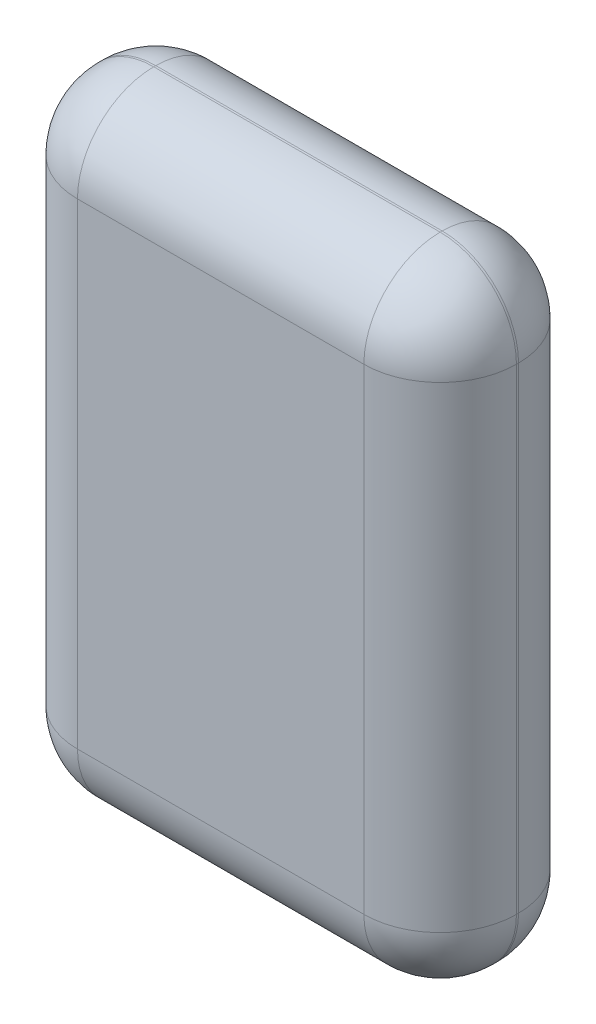
ISO-10303-21;
HEADER;
FILE_DESCRIPTION(('STEP AP214'),'2;1');
FILE_NAME('part.step','',(''),(''),'','','');
FILE_SCHEMA(('AUTOMOTIVE_DESIGN { 1 0 10303 214 1 1 1 1 }'));
ENDSEC;
DATA;
#1=APPLICATION_CONTEXT('core data for automotive mechanical design processes');
#2=APPLICATION_PROTOCOL_DEFINITION('international standard','automotive_design',2000,#1);
#3=PRODUCT_CONTEXT('',#1,'mechanical');
#4=PRODUCT('Part','Part','',(#3));
#5=PRODUCT_RELATED_PRODUCT_CATEGORY('part','',(#4));
#6=PRODUCT_DEFINITION_FORMATION('','',#4);
#7=PRODUCT_DEFINITION_CONTEXT('part definition',#1,'design');
#8=PRODUCT_DEFINITION('design','',#6,#7);
#9=PRODUCT_DEFINITION_SHAPE('','',#8);
#10=(LENGTH_UNIT() NAMED_UNIT(*) SI_UNIT(.MILLI.,.METRE.));
#11=(NAMED_UNIT(*) PLANE_ANGLE_UNIT() SI_UNIT($,.RADIAN.));
#12=(NAMED_UNIT(*) SI_UNIT($,.STERADIAN.) SOLID_ANGLE_UNIT());
#13=UNCERTAINTY_MEASURE_WITH_UNIT(LENGTH_MEASURE(1.E-05),#10,'distance_accuracy_value','');
#14=(GEOMETRIC_REPRESENTATION_CONTEXT(3) GLOBAL_UNCERTAINTY_ASSIGNED_CONTEXT((#13)) GLOBAL_UNIT_ASSIGNED_CONTEXT((#10,
#11,#12)) REPRESENTATION_CONTEXT('',''));
#15=CARTESIAN_POINT('',(0.,0.,0.));
#16=DIRECTION('',(0.,0.,1.));
#17=DIRECTION('',(1.,0.,0.));
#18=AXIS2_PLACEMENT_3D('',#15,#16,#17);
#19=CARTESIAN_POINT('',(31.65,-45.35,11.15));
#20=DIRECTION('',(-1.,0.,0.));
#21=DIRECTION('',(0.,0.,1.));
#22=AXIS2_PLACEMENT_3D('',#19,#20,#21);
#23=PLANE('',#22);
#24=DIRECTION('',(0.,1.,0.));
#25=VECTOR('',#24,1.);
#26=CARTESIAN_POINT('',(31.65,-45.35,0.150000000000001));
#27=LINE('',#26,#25);
#28=CARTESIAN_POINT('',(31.65,34.35,0.150000000000001));
#29=VERTEX_POINT('',#28);
#30=CARTESIAN_POINT('',(31.65,-34.35,0.150000000000001));
#31=VERTEX_POINT('',#30);
#32=EDGE_CURVE('E178',#29,#31,#27,.F.);
#33=ORIENTED_EDGE('',*,*,#32,.T.);
#34=DIRECTION('',(0.,0.,-1.));
#35=VECTOR('',#34,1.);
#36=CARTESIAN_POINT('',(31.65,-34.35,11.15));
#37=LINE('',#36,#35);
#38=CARTESIAN_POINT('',(31.65,-34.35,-0.150000000000001));
#39=VERTEX_POINT('',#38);
#40=EDGE_CURVE('E183',#31,#39,#37,.T.);
#41=ORIENTED_EDGE('',*,*,#40,.T.);
#42=DIRECTION('',(0.,1.,0.));
#43=VECTOR('',#42,1.);
#44=CARTESIAN_POINT('',(31.65,45.35,-0.150000000000001));
#45=LINE('',#44,#43);
#46=CARTESIAN_POINT('',(31.65,34.35,-0.150000000000001));
#47=VERTEX_POINT('',#46);
#48=EDGE_CURVE('E180',#39,#47,#45,.T.);
#49=ORIENTED_EDGE('',*,*,#48,.T.);
#50=DIRECTION('',(0.,0.,-1.));
#51=VECTOR('',#50,1.);
#52=CARTESIAN_POINT('',(31.65,34.35,11.15));
#53=LINE('',#52,#51);
#54=EDGE_CURVE('E176',#47,#29,#53,.F.);
#55=ORIENTED_EDGE('',*,*,#54,.T.);
#56=EDGE_LOOP('',(#33,#41,#49,#55));
#57=FACE_BOUND('',#56,.T.);
#58=ADVANCED_FACE('F36',(#57),#23,.F.);
#59=CARTESIAN_POINT('',(-31.65,45.35,11.15));
#60=DIRECTION('',(0.,-1.,0.));
#61=DIRECTION('',(0.,0.,-1.));
#62=AXIS2_PLACEMENT_3D('',#59,#60,#61);
#63=PLANE('',#62);
#64=DIRECTION('',(-1.,0.,0.));
#65=VECTOR('',#64,1.);
#66=CARTESIAN_POINT('',(-31.65,45.35,0.150000000000001));
#67=LINE('',#66,#65);
#68=CARTESIAN_POINT('',(-20.65,45.35,0.150000000000001));
#69=VERTEX_POINT('',#68);
#70=CARTESIAN_POINT('',(20.65,45.35,0.150000000000001));
#71=VERTEX_POINT('',#70);
#72=EDGE_CURVE('E45',#69,#71,#67,.F.);
#73=ORIENTED_EDGE('',*,*,#72,.T.);
#74=DIRECTION('',(0.,0.,-1.));
#75=VECTOR('',#74,1.);
#76=CARTESIAN_POINT('',(20.65,45.35,11.15));
#77=LINE('',#76,#75);
#78=CARTESIAN_POINT('',(20.65,45.35,-0.150000000000001));
#79=VERTEX_POINT('',#78);
#80=EDGE_CURVE('E11',#71,#79,#77,.T.);
#81=ORIENTED_EDGE('',*,*,#80,.T.);
#82=DIRECTION('',(-1.,0.,0.));
#83=VECTOR('',#82,1.);
#84=CARTESIAN_POINT('',(-31.65,45.35,-0.150000000000001));
#85=LINE('',#84,#83);
#86=CARTESIAN_POINT('',(-20.65,45.35,-0.150000000000001));
#87=VERTEX_POINT('',#86);
#88=EDGE_CURVE('E201',#79,#87,#85,.T.);
#89=ORIENTED_EDGE('',*,*,#88,.T.);
#90=DIRECTION('',(0.,0.,-1.));
#91=VECTOR('',#90,1.);
#92=CARTESIAN_POINT('',(-20.65,45.35,11.15));
#93=LINE('',#92,#91);
#94=EDGE_CURVE('E56',#87,#69,#93,.F.);
#95=ORIENTED_EDGE('',*,*,#94,.T.);
#96=EDGE_LOOP('',(#73,#81,#89,#95));
#97=FACE_BOUND('',#96,.T.);
#98=ADVANCED_FACE('F310',(#97),#63,.F.);
#99=CARTESIAN_POINT('',(-31.65,-45.35,11.15));
#100=DIRECTION('',(1.,0.,0.));
#101=DIRECTION('',(0.,0.,-1.));
#102=AXIS2_PLACEMENT_3D('',#99,#100,#101);
#103=PLANE('',#102);
#104=DIRECTION('',(0.,-1.,0.));
#105=VECTOR('',#104,1.);
#106=CARTESIAN_POINT('',(-31.65,-45.35,-0.150000000000001));
#107=LINE('',#106,#105);
#108=CARTESIAN_POINT('',(-31.65,34.35,-0.150000000000001));
#109=VERTEX_POINT('',#108);
#110=CARTESIAN_POINT('',(-31.65,-34.35,-0.150000000000001));
#111=VERTEX_POINT('',#110);
#112=EDGE_CURVE('E135',#109,#111,#107,.T.);
#113=ORIENTED_EDGE('',*,*,#112,.T.);
#114=DIRECTION('',(0.,0.,-1.));
#115=VECTOR('',#114,1.);
#116=CARTESIAN_POINT('',(-31.65,-34.35,11.15));
#117=LINE('',#116,#115);
#118=CARTESIAN_POINT('',(-31.65,-34.35,0.150000000000001));
#119=VERTEX_POINT('',#118);
#120=EDGE_CURVE('E131',#111,#119,#117,.F.);
#121=ORIENTED_EDGE('',*,*,#120,.T.);
#122=DIRECTION('',(0.,-1.,0.));
#123=VECTOR('',#122,1.);
#124=CARTESIAN_POINT('',(-31.65,-45.35,0.150000000000001));
#125=LINE('',#124,#123);
#126=CARTESIAN_POINT('',(-31.65,34.35,0.150000000000001));
#127=VERTEX_POINT('',#126);
#128=EDGE_CURVE('E123',#119,#127,#125,.F.);
#129=ORIENTED_EDGE('',*,*,#128,.T.);
#130=DIRECTION('',(0.,0.,-1.));
#131=VECTOR('',#130,1.);
#132=CARTESIAN_POINT('',(-31.65,34.35,11.15));
#133=LINE('',#132,#131);
#134=EDGE_CURVE('E128',#127,#109,#133,.T.);
#135=ORIENTED_EDGE('',*,*,#134,.T.);
#136=EDGE_LOOP('',(#113,#121,#129,#135));
#137=FACE_BOUND('',#136,.T.);
#138=ADVANCED_FACE('F126',(#137),#103,.F.);
#139=CARTESIAN_POINT('',(-31.65,-45.35,11.15));
#140=DIRECTION('',(0.,1.,0.));
#141=DIRECTION('',(0.,0.,1.));
#142=AXIS2_PLACEMENT_3D('',#139,#140,#141);
#143=PLANE('',#142);
#144=DIRECTION('',(1.,0.,0.));
#145=VECTOR('',#144,1.);
#146=CARTESIAN_POINT('',(-31.65,-45.35,0.150000000000001));
#147=LINE('',#146,#145);
#148=CARTESIAN_POINT('',(20.65,-45.35,0.150000000000001));
#149=VERTEX_POINT('',#148);
#150=CARTESIAN_POINT('',(-20.65,-45.35,0.150000000000001));
#151=VERTEX_POINT('',#150);
#152=EDGE_CURVE('E196',#149,#151,#147,.F.);
#153=ORIENTED_EDGE('',*,*,#152,.T.);
#154=DIRECTION('',(0.,0.,-1.));
#155=VECTOR('',#154,1.);
#156=CARTESIAN_POINT('',(-20.65,-45.35,11.15));
#157=LINE('',#156,#155);
#158=CARTESIAN_POINT('',(-20.65,-45.35,-0.150000000000001));
#159=VERTEX_POINT('',#158);
#160=EDGE_CURVE('E198',#151,#159,#157,.T.);
#161=ORIENTED_EDGE('',*,*,#160,.T.);
#162=DIRECTION('',(1.,0.,0.));
#163=VECTOR('',#162,1.);
#164=CARTESIAN_POINT('',(31.65,-45.35,-0.150000000000001));
#165=LINE('',#164,#163);
#166=CARTESIAN_POINT('',(20.65,-45.35,-0.150000000000001));
#167=VERTEX_POINT('',#166);
#168=EDGE_CURVE('E192',#159,#167,#165,.T.);
#169=ORIENTED_EDGE('',*,*,#168,.T.);
#170=DIRECTION('',(0.,0.,-1.));
#171=VECTOR('',#170,1.);
#172=CARTESIAN_POINT('',(20.65,-45.35,11.15));
#173=LINE('',#172,#171);
#174=EDGE_CURVE('E194',#167,#149,#173,.F.);
#175=ORIENTED_EDGE('',*,*,#174,.T.);
#176=EDGE_LOOP('',(#153,#161,#169,#175));
#177=FACE_BOUND('',#176,.T.);
#178=ADVANCED_FACE('F267',(#177),#143,.F.);
#179=CARTESIAN_POINT('',(0.,0.,11.15));
#180=DIRECTION('',(0.,0.,-1.));
#181=DIRECTION('',(-1.,0.,0.));
#182=AXIS2_PLACEMENT_3D('',#179,#180,#181);
#183=PLANE('',#182);
#184=DIRECTION('',(0.,-1.,0.));
#185=VECTOR('',#184,1.);
#186=CARTESIAN_POINT('',(-20.65,0.,11.15));
#187=LINE('',#186,#185);
#188=CARTESIAN_POINT('',(-20.65,34.35,11.15));
#189=VERTEX_POINT('',#188);
#190=CARTESIAN_POINT('',(-20.65,-34.35,11.15));
#191=VERTEX_POINT('',#190);
#192=EDGE_CURVE('E143',#189,#191,#187,.T.);
#193=ORIENTED_EDGE('',*,*,#192,.T.);
#194=DIRECTION('',(1.,0.,0.));
#195=VECTOR('',#194,1.);
#196=CARTESIAN_POINT('',(0.,-34.35,11.15));
#197=LINE('',#196,#195);
#198=CARTESIAN_POINT('',(20.65,-34.35,11.15));
#199=VERTEX_POINT('',#198);
#200=EDGE_CURVE('E190',#191,#199,#197,.T.);
#201=ORIENTED_EDGE('',*,*,#200,.T.);
#202=DIRECTION('',(0.,1.,0.));
#203=VECTOR('',#202,1.);
#204=CARTESIAN_POINT('',(20.65,0.,11.15));
#205=LINE('',#204,#203);
#206=CARTESIAN_POINT('',(20.65,34.35,11.15));
#207=VERTEX_POINT('',#206);
#208=EDGE_CURVE('E187',#199,#207,#205,.T.);
#209=ORIENTED_EDGE('',*,*,#208,.T.);
#210=DIRECTION('',(-1.,0.,0.));
#211=VECTOR('',#210,1.);
#212=CARTESIAN_POINT('',(0.,34.35,11.15));
#213=LINE('',#212,#211);
#214=EDGE_CURVE('E185',#207,#189,#213,.T.);
#215=ORIENTED_EDGE('',*,*,#214,.T.);
#216=EDGE_LOOP('',(#193,#201,#209,#215));
#217=FACE_BOUND('',#216,.T.);
#218=ADVANCED_FACE('F298',(#217),#183,.F.);
#219=CARTESIAN_POINT('',(0.,0.,-11.15));
#220=DIRECTION('',(0.,0.,-1.));
#221=DIRECTION('',(-1.,0.,0.));
#222=AXIS2_PLACEMENT_3D('',#219,#220,#221);
#223=PLANE('',#222);
#224=DIRECTION('',(0.,1.,0.));
#225=VECTOR('',#224,1.);
#226=CARTESIAN_POINT('',(20.65,-45.35,-11.15));
#227=LINE('',#226,#225);
#228=CARTESIAN_POINT('',(20.65,34.35,-11.15));
#229=VERTEX_POINT('',#228);
#230=CARTESIAN_POINT('',(20.65,-34.35,-11.15));
#231=VERTEX_POINT('',#230);
#232=EDGE_CURVE('E169',#229,#231,#227,.F.);
#233=ORIENTED_EDGE('',*,*,#232,.T.);
#234=DIRECTION('',(1.,0.,0.));
#235=VECTOR('',#234,1.);
#236=CARTESIAN_POINT('',(-31.65,-34.35,-11.15));
#237=LINE('',#236,#235);
#238=CARTESIAN_POINT('',(-20.65,-34.35,-11.15));
#239=VERTEX_POINT('',#238);
#240=EDGE_CURVE('E174',#231,#239,#237,.F.);
#241=ORIENTED_EDGE('',*,*,#240,.T.);
#242=DIRECTION('',(0.,-1.,0.));
#243=VECTOR('',#242,1.);
#244=CARTESIAN_POINT('',(-20.65,45.35,-11.15));
#245=LINE('',#244,#243);
#246=CARTESIAN_POINT('',(-20.65,34.35,-11.15));
#247=VERTEX_POINT('',#246);
#248=EDGE_CURVE('E171',#239,#247,#245,.F.);
#249=ORIENTED_EDGE('',*,*,#248,.T.);
#250=DIRECTION('',(-1.,0.,0.));
#251=VECTOR('',#250,1.);
#252=CARTESIAN_POINT('',(31.65,34.35,-11.15));
#253=LINE('',#252,#251);
#254=EDGE_CURVE('E167',#247,#229,#253,.F.);
#255=ORIENTED_EDGE('',*,*,#254,.T.);
#256=EDGE_LOOP('',(#233,#241,#249,#255));
#257=FACE_BOUND('',#256,.T.);
#258=ADVANCED_FACE('F300',(#257),#223,.T.);
#259=CARTESIAN_POINT('',(20.65,0.,0.150000000000001));
#260=DIRECTION('',(0.,1.,0.));
#261=DIRECTION('',(0.,0.,1.));
#262=AXIS2_PLACEMENT_3D('',#259,#260,#261);
#263=CYLINDRICAL_SURFACE('',#262,11.);
#264=CARTESIAN_POINT('',(20.65,34.35,0.150000000000001));
#265=DIRECTION('',(0.,1.,0.));
#266=DIRECTION('',(0.,0.,1.));
#267=AXIS2_PLACEMENT_3D('',#264,#265,#266);
#268=CIRCLE('',#267,11.);
#269=EDGE_CURVE('E40',#207,#29,#268,.T.);
#270=ORIENTED_EDGE('',*,*,#269,.F.);
#271=ORIENTED_EDGE('',*,*,#208,.F.);
#272=CARTESIAN_POINT('',(20.65,-34.35,0.150000000000001));
#273=DIRECTION('',(0.,-1.,0.));
#274=DIRECTION('',(0.,0.,-1.));
#275=AXIS2_PLACEMENT_3D('',#272,#273,#274);
#276=CIRCLE('',#275,11.);
#277=EDGE_CURVE('E163',#31,#199,#276,.T.);
#278=ORIENTED_EDGE('',*,*,#277,.F.);
#279=ORIENTED_EDGE('',*,*,#32,.F.);
#280=EDGE_LOOP('',(#270,#271,#278,#279));
#281=FACE_BOUND('',#280,.T.);
#282=ADVANCED_FACE('F38',(#281),#263,.T.);
#283=CARTESIAN_POINT('',(20.65,34.35,0.150000000000001));
#284=DIRECTION('',(0.,0.,1.));
#285=DIRECTION('',(1.,0.,0.));
#286=AXIS2_PLACEMENT_3D('',#283,#284,#285);
#287=SPHERICAL_SURFACE('',#286,11.);
#288=CARTESIAN_POINT('',(20.65,34.35,0.150000000000001));
#289=DIRECTION('',(1.,0.,0.));
#290=DIRECTION('',(0.,0.,-1.));
#291=AXIS2_PLACEMENT_3D('',#288,#289,#290);
#292=CIRCLE('',#291,11.);
#293=EDGE_CURVE('E246',#207,#71,#292,.F.);
#294=ORIENTED_EDGE('',*,*,#293,.F.);
#295=ORIENTED_EDGE('',*,*,#269,.T.);
#296=CARTESIAN_POINT('',(20.65,34.35,0.150000000000001));
#297=DIRECTION('',(0.,0.,1.));
#298=DIRECTION('',(1.,0.,0.));
#299=AXIS2_PLACEMENT_3D('',#296,#297,#298);
#300=CIRCLE('',#299,11.);
#301=EDGE_CURVE('E248',#71,#29,#300,.F.);
#302=ORIENTED_EDGE('',*,*,#301,.F.);
#303=EDGE_LOOP('',(#294,#295,#302));
#304=FACE_BOUND('',#303,.T.);
#305=ADVANCED_FACE('F293',(#304),#287,.T.);
#306=CARTESIAN_POINT('',(20.65,-34.35,0.150000000000001));
#307=DIRECTION('',(0.,0.,1.));
#308=DIRECTION('',(1.,0.,0.));
#309=AXIS2_PLACEMENT_3D('',#306,#307,#308);
#310=SPHERICAL_SURFACE('',#309,11.);
#311=CARTESIAN_POINT('',(20.65,-34.35,0.150000000000001));
#312=DIRECTION('',(0.,0.,1.));
#313=DIRECTION('',(1.,0.,0.));
#314=AXIS2_PLACEMENT_3D('',#311,#312,#313);
#315=CIRCLE('',#314,11.);
#316=EDGE_CURVE('E240',#31,#149,#315,.F.);
#317=ORIENTED_EDGE('',*,*,#316,.F.);
#318=ORIENTED_EDGE('',*,*,#277,.T.);
#319=CARTESIAN_POINT('',(20.65,-34.35,0.150000000000001));
#320=DIRECTION('',(1.,0.,0.));
#321=DIRECTION('',(0.,0.,-1.));
#322=AXIS2_PLACEMENT_3D('',#319,#320,#321);
#323=CIRCLE('',#322,11.);
#324=EDGE_CURVE('E243',#149,#199,#323,.F.);
#325=ORIENTED_EDGE('',*,*,#324,.F.);
#326=EDGE_LOOP('',(#317,#318,#325));
#327=FACE_BOUND('',#326,.T.);
#328=ADVANCED_FACE('F255',(#327),#310,.T.);
#329=CARTESIAN_POINT('',(20.65,34.35,11.15));
#330=DIRECTION('',(0.,0.,-1.));
#331=DIRECTION('',(-1.,0.,0.));
#332=AXIS2_PLACEMENT_3D('',#329,#330,#331);
#333=CYLINDRICAL_SURFACE('',#332,11.);
#334=ORIENTED_EDGE('',*,*,#301,.T.);
#335=ORIENTED_EDGE('',*,*,#54,.F.);
#336=CARTESIAN_POINT('',(20.65,34.35,-0.150000000000001));
#337=DIRECTION('',(0.,0.,-1.));
#338=DIRECTION('',(-1.,0.,0.));
#339=AXIS2_PLACEMENT_3D('',#336,#337,#338);
#340=CIRCLE('',#339,11.);
#341=EDGE_CURVE('E235',#79,#47,#340,.T.);
#342=ORIENTED_EDGE('',*,*,#341,.F.);
#343=ORIENTED_EDGE('',*,*,#80,.F.);
#344=EDGE_LOOP('',(#334,#335,#342,#343));
#345=FACE_BOUND('',#344,.T.);
#346=ADVANCED_FACE('F287',(#345),#333,.T.);
#347=CARTESIAN_POINT('',(0.,34.35,0.150000000000001));
#348=DIRECTION('',(-1.,0.,0.));
#349=DIRECTION('',(0.,0.,1.));
#350=AXIS2_PLACEMENT_3D('',#347,#348,#349);
#351=CYLINDRICAL_SURFACE('',#350,11.);
#352=ORIENTED_EDGE('',*,*,#293,.T.);
#353=ORIENTED_EDGE('',*,*,#72,.F.);
#354=CARTESIAN_POINT('',(-20.65,34.35,0.150000000000001));
#355=DIRECTION('',(-1.,0.,0.));
#356=DIRECTION('',(0.,0.,1.));
#357=AXIS2_PLACEMENT_3D('',#354,#355,#356);
#358=CIRCLE('',#357,11.);
#359=EDGE_CURVE('E147',#189,#69,#358,.T.);
#360=ORIENTED_EDGE('',*,*,#359,.F.);
#361=ORIENTED_EDGE('',*,*,#214,.F.);
#362=EDGE_LOOP('',(#352,#353,#360,#361));
#363=FACE_BOUND('',#362,.T.);
#364=ADVANCED_FACE('F296',(#363),#351,.T.);
#365=CARTESIAN_POINT('',(-20.65,0.,0.150000000000001));
#366=DIRECTION('',(0.,-1.,0.));
#367=DIRECTION('',(0.,0.,-1.));
#368=AXIS2_PLACEMENT_3D('',#365,#366,#367);
#369=CYLINDRICAL_SURFACE('',#368,11.);
#370=CARTESIAN_POINT('',(-20.65,-34.35,0.150000000000001));
#371=DIRECTION('',(0.,-1.,0.));
#372=DIRECTION('',(0.,0.,-1.));
#373=AXIS2_PLACEMENT_3D('',#370,#371,#372);
#374=CIRCLE('',#373,11.);
#375=EDGE_CURVE('E148',#191,#119,#374,.T.);
#376=ORIENTED_EDGE('',*,*,#375,.F.);
#377=ORIENTED_EDGE('',*,*,#192,.F.);
#378=CARTESIAN_POINT('',(-20.65,34.35,0.150000000000001));
#379=DIRECTION('',(0.,1.,0.));
#380=DIRECTION('',(0.,0.,1.));
#381=AXIS2_PLACEMENT_3D('',#378,#379,#380);
#382=CIRCLE('',#381,11.);
#383=EDGE_CURVE('E139',#127,#189,#382,.T.);
#384=ORIENTED_EDGE('',*,*,#383,.F.);
#385=ORIENTED_EDGE('',*,*,#128,.F.);
#386=EDGE_LOOP('',(#376,#377,#384,#385));
#387=FACE_BOUND('',#386,.T.);
#388=ADVANCED_FACE('F141',(#387),#369,.T.);
#389=CARTESIAN_POINT('',(0.,-34.35,0.150000000000001));
#390=DIRECTION('',(1.,0.,0.));
#391=DIRECTION('',(0.,0.,-1.));
#392=AXIS2_PLACEMENT_3D('',#389,#390,#391);
#393=CYLINDRICAL_SURFACE('',#392,11.);
#394=ORIENTED_EDGE('',*,*,#324,.T.);
#395=ORIENTED_EDGE('',*,*,#200,.F.);
#396=CARTESIAN_POINT('',(-20.65,-34.35,0.150000000000001));
#397=DIRECTION('',(-1.,0.,0.));
#398=DIRECTION('',(0.,0.,1.));
#399=AXIS2_PLACEMENT_3D('',#396,#397,#398);
#400=CIRCLE('',#399,11.);
#401=EDGE_CURVE('E231',#151,#191,#400,.T.);
#402=ORIENTED_EDGE('',*,*,#401,.F.);
#403=ORIENTED_EDGE('',*,*,#152,.F.);
#404=EDGE_LOOP('',(#394,#395,#402,#403));
#405=FACE_BOUND('',#404,.T.);
#406=ADVANCED_FACE('F263',(#405),#393,.T.);
#407=CARTESIAN_POINT('',(20.65,-34.35,11.15));
#408=DIRECTION('',(0.,0.,-1.));
#409=DIRECTION('',(-1.,0.,0.));
#410=AXIS2_PLACEMENT_3D('',#407,#408,#409);
#411=CYLINDRICAL_SURFACE('',#410,11.);
#412=ORIENTED_EDGE('',*,*,#316,.T.);
#413=ORIENTED_EDGE('',*,*,#174,.F.);
#414=CARTESIAN_POINT('',(20.65,-34.35,-0.150000000000001));
#415=DIRECTION('',(0.,0.,-1.));
#416=DIRECTION('',(-1.,0.,0.));
#417=AXIS2_PLACEMENT_3D('',#414,#415,#416);
#418=CIRCLE('',#417,11.);
#419=EDGE_CURVE('E228',#39,#167,#418,.T.);
#420=ORIENTED_EDGE('',*,*,#419,.F.);
#421=ORIENTED_EDGE('',*,*,#40,.F.);
#422=EDGE_LOOP('',(#412,#413,#420,#421));
#423=FACE_BOUND('',#422,.T.);
#424=ADVANCED_FACE('F273',(#423),#411,.T.);
#425=CARTESIAN_POINT('',(20.65,-45.35,-0.150000000000001));
#426=DIRECTION('',(0.,-1.,0.));
#427=DIRECTION('',(0.,0.,-1.));
#428=AXIS2_PLACEMENT_3D('',#425,#426,#427);
#429=CYLINDRICAL_SURFACE('',#428,11.);
#430=CARTESIAN_POINT('',(20.65,34.35,-0.150000000000001));
#431=DIRECTION('',(0.,1.,0.));
#432=DIRECTION('',(0.,0.,1.));
#433=AXIS2_PLACEMENT_3D('',#430,#431,#432);
#434=CIRCLE('',#433,11.);
#435=EDGE_CURVE('E237',#47,#229,#434,.T.);
#436=ORIENTED_EDGE('',*,*,#435,.F.);
#437=ORIENTED_EDGE('',*,*,#48,.F.);
#438=CARTESIAN_POINT('',(20.65,-34.35,-0.150000000000001));
#439=DIRECTION('',(0.,-1.,0.));
#440=DIRECTION('',(0.,0.,-1.));
#441=AXIS2_PLACEMENT_3D('',#438,#439,#440);
#442=CIRCLE('',#441,11.);
#443=EDGE_CURVE('E225',#231,#39,#442,.T.);
#444=ORIENTED_EDGE('',*,*,#443,.F.);
#445=ORIENTED_EDGE('',*,*,#232,.F.);
#446=EDGE_LOOP('',(#436,#437,#444,#445));
#447=FACE_BOUND('',#446,.T.);
#448=ADVANCED_FACE('F279',(#447),#429,.T.);
#449=CARTESIAN_POINT('',(20.65,34.35,-0.150000000000001));
#450=DIRECTION('',(0.,0.,1.));
#451=DIRECTION('',(1.,0.,0.));
#452=AXIS2_PLACEMENT_3D('',#449,#450,#451);
#453=SPHERICAL_SURFACE('',#452,11.);
#454=ORIENTED_EDGE('',*,*,#341,.T.);
#455=ORIENTED_EDGE('',*,*,#435,.T.);
#456=CARTESIAN_POINT('',(20.65,34.35,-0.150000000000001));
#457=DIRECTION('',(1.,0.,0.));
#458=DIRECTION('',(0.,1.,0.));
#459=AXIS2_PLACEMENT_3D('',#456,#457,#458);
#460=CIRCLE('',#459,11.);
#461=EDGE_CURVE('E154',#79,#229,#460,.F.);
#462=ORIENTED_EDGE('',*,*,#461,.F.);
#463=EDGE_LOOP('',(#454,#455,#462));
#464=FACE_BOUND('',#463,.T.);
#465=ADVANCED_FACE('F354',(#464),#453,.T.);
#466=CARTESIAN_POINT('',(-20.65,34.35,0.150000000000001));
#467=DIRECTION('',(0.,0.,1.));
#468=DIRECTION('',(1.,0.,0.));
#469=AXIS2_PLACEMENT_3D('',#466,#467,#468);
#470=SPHERICAL_SURFACE('',#469,11.);
#471=ORIENTED_EDGE('',*,*,#383,.T.);
#472=ORIENTED_EDGE('',*,*,#359,.T.);
#473=CARTESIAN_POINT('',(-20.65,34.35,0.150000000000001));
#474=DIRECTION('',(0.,0.,1.));
#475=DIRECTION('',(1.,0.,0.));
#476=AXIS2_PLACEMENT_3D('',#473,#474,#475);
#477=CIRCLE('',#476,11.);
#478=EDGE_CURVE('E151',#127,#69,#477,.F.);
#479=ORIENTED_EDGE('',*,*,#478,.F.);
#480=EDGE_LOOP('',(#471,#472,#479));
#481=FACE_BOUND('',#480,.T.);
#482=ADVANCED_FACE('F152',(#481),#470,.T.);
#483=CARTESIAN_POINT('',(-20.65,-34.35,0.150000000000001));
#484=DIRECTION('',(0.,0.,1.));
#485=DIRECTION('',(1.,0.,0.));
#486=AXIS2_PLACEMENT_3D('',#483,#484,#485);
#487=SPHERICAL_SURFACE('',#486,11.);
#488=ORIENTED_EDGE('',*,*,#401,.T.);
#489=ORIENTED_EDGE('',*,*,#375,.T.);
#490=CARTESIAN_POINT('',(-20.65,-34.35,0.150000000000001));
#491=DIRECTION('',(0.,0.,1.));
#492=DIRECTION('',(1.,0.,0.));
#493=AXIS2_PLACEMENT_3D('',#490,#491,#492);
#494=CIRCLE('',#493,11.);
#495=EDGE_CURVE('E155',#151,#119,#494,.F.);
#496=ORIENTED_EDGE('',*,*,#495,.F.);
#497=EDGE_LOOP('',(#488,#489,#496));
#498=FACE_BOUND('',#497,.T.);
#499=ADVANCED_FACE('F347',(#498),#487,.T.);
#500=CARTESIAN_POINT('',(20.65,-34.35,-0.150000000000001));
#501=DIRECTION('',(0.,0.,1.));
#502=DIRECTION('',(1.,0.,0.));
#503=AXIS2_PLACEMENT_3D('',#500,#501,#502);
#504=SPHERICAL_SURFACE('',#503,11.);
#505=ORIENTED_EDGE('',*,*,#443,.T.);
#506=ORIENTED_EDGE('',*,*,#419,.T.);
#507=CARTESIAN_POINT('',(20.65,-34.35,-0.150000000000001));
#508=DIRECTION('',(1.,0.,0.));
#509=DIRECTION('',(0.,0.,-1.));
#510=AXIS2_PLACEMENT_3D('',#507,#508,#509);
#511=CIRCLE('',#510,11.);
#512=EDGE_CURVE('E218',#231,#167,#511,.F.);
#513=ORIENTED_EDGE('',*,*,#512,.F.);
#514=EDGE_LOOP('',(#505,#506,#513));
#515=FACE_BOUND('',#514,.T.);
#516=ADVANCED_FACE('F343',(#515),#504,.T.);
#517=CARTESIAN_POINT('',(-31.65,34.35,-0.150000000000001));
#518=DIRECTION('',(1.,0.,0.));
#519=DIRECTION('',(0.,0.,-1.));
#520=AXIS2_PLACEMENT_3D('',#517,#518,#519);
#521=CYLINDRICAL_SURFACE('',#520,11.);
#522=ORIENTED_EDGE('',*,*,#461,.T.);
#523=ORIENTED_EDGE('',*,*,#254,.F.);
#524=CARTESIAN_POINT('',(-20.65,34.35,-0.150000000000001));
#525=DIRECTION('',(-1.,0.,0.));
#526=DIRECTION('',(0.,0.,1.));
#527=AXIS2_PLACEMENT_3D('',#524,#525,#526);
#528=CIRCLE('',#527,11.);
#529=EDGE_CURVE('E215',#87,#247,#528,.T.);
#530=ORIENTED_EDGE('',*,*,#529,.F.);
#531=ORIENTED_EDGE('',*,*,#88,.F.);
#532=EDGE_LOOP('',(#522,#523,#530,#531));
#533=FACE_BOUND('',#532,.T.);
#534=ADVANCED_FACE('F340',(#533),#521,.T.);
#535=CARTESIAN_POINT('',(-20.65,34.35,11.15));
#536=DIRECTION('',(0.,0.,-1.));
#537=DIRECTION('',(-1.,0.,0.));
#538=AXIS2_PLACEMENT_3D('',#535,#536,#537);
#539=CYLINDRICAL_SURFACE('',#538,11.);
#540=ORIENTED_EDGE('',*,*,#478,.T.);
#541=ORIENTED_EDGE('',*,*,#94,.F.);
#542=CARTESIAN_POINT('',(-20.65,34.35,-0.150000000000001));
#543=DIRECTION('',(0.,0.,-1.));
#544=DIRECTION('',(-1.,0.,0.));
#545=AXIS2_PLACEMENT_3D('',#542,#543,#544);
#546=CIRCLE('',#545,11.);
#547=EDGE_CURVE('E159',#109,#87,#546,.T.);
#548=ORIENTED_EDGE('',*,*,#547,.F.);
#549=ORIENTED_EDGE('',*,*,#134,.F.);
#550=EDGE_LOOP('',(#540,#541,#548,#549));
#551=FACE_BOUND('',#550,.T.);
#552=ADVANCED_FACE('F157',(#551),#539,.T.);
#553=CARTESIAN_POINT('',(-20.65,-34.35,11.15));
#554=DIRECTION('',(0.,0.,-1.));
#555=DIRECTION('',(-1.,0.,0.));
#556=AXIS2_PLACEMENT_3D('',#553,#554,#555);
#557=CYLINDRICAL_SURFACE('',#556,11.);
#558=ORIENTED_EDGE('',*,*,#495,.T.);
#559=ORIENTED_EDGE('',*,*,#120,.F.);
#560=CARTESIAN_POINT('',(-20.65,-34.35,-0.150000000000001));
#561=DIRECTION('',(0.,0.,-1.));
#562=DIRECTION('',(-1.,0.,0.));
#563=AXIS2_PLACEMENT_3D('',#560,#561,#562);
#564=CIRCLE('',#563,11.);
#565=EDGE_CURVE('E211',#159,#111,#564,.T.);
#566=ORIENTED_EDGE('',*,*,#565,.F.);
#567=ORIENTED_EDGE('',*,*,#160,.F.);
#568=EDGE_LOOP('',(#558,#559,#566,#567));
#569=FACE_BOUND('',#568,.T.);
#570=ADVANCED_FACE('F333',(#569),#557,.T.);
#571=CARTESIAN_POINT('',(-31.65,-34.35,-0.150000000000001));
#572=DIRECTION('',(-1.,0.,0.));
#573=DIRECTION('',(0.,0.,1.));
#574=AXIS2_PLACEMENT_3D('',#571,#572,#573);
#575=CYLINDRICAL_SURFACE('',#574,11.);
#576=ORIENTED_EDGE('',*,*,#512,.T.);
#577=ORIENTED_EDGE('',*,*,#168,.F.);
#578=CARTESIAN_POINT('',(-20.65,-34.35,-0.150000000000001));
#579=DIRECTION('',(-1.,0.,0.));
#580=DIRECTION('',(0.,0.,1.));
#581=AXIS2_PLACEMENT_3D('',#578,#579,#580);
#582=CIRCLE('',#581,11.);
#583=EDGE_CURVE('E209',#239,#159,#582,.T.);
#584=ORIENTED_EDGE('',*,*,#583,.F.);
#585=ORIENTED_EDGE('',*,*,#240,.F.);
#586=EDGE_LOOP('',(#576,#577,#584,#585));
#587=FACE_BOUND('',#586,.T.);
#588=ADVANCED_FACE('F329',(#587),#575,.T.);
#589=CARTESIAN_POINT('',(-20.65,34.35,-0.150000000000001));
#590=DIRECTION('',(0.,0.,1.));
#591=DIRECTION('',(1.,0.,0.));
#592=AXIS2_PLACEMENT_3D('',#589,#590,#591);
#593=SPHERICAL_SURFACE('',#592,11.);
#594=ORIENTED_EDGE('',*,*,#547,.T.);
#595=ORIENTED_EDGE('',*,*,#529,.T.);
#596=CARTESIAN_POINT('',(-20.65,34.35,-0.150000000000001));
#597=DIRECTION('',(0.,1.,0.));
#598=DIRECTION('',(0.,0.,1.));
#599=AXIS2_PLACEMENT_3D('',#596,#597,#598);
#600=CIRCLE('',#599,11.);
#601=EDGE_CURVE('E207',#109,#247,#600,.F.);
#602=ORIENTED_EDGE('',*,*,#601,.F.);
#603=EDGE_LOOP('',(#594,#595,#602));
#604=FACE_BOUND('',#603,.T.);
#605=ADVANCED_FACE('F325',(#604),#593,.T.);
#606=CARTESIAN_POINT('',(-20.65,-34.35,-0.150000000000001));
#607=DIRECTION('',(0.,0.,1.));
#608=DIRECTION('',(1.,0.,0.));
#609=AXIS2_PLACEMENT_3D('',#606,#607,#608);
#610=SPHERICAL_SURFACE('',#609,11.);
#611=ORIENTED_EDGE('',*,*,#583,.T.);
#612=ORIENTED_EDGE('',*,*,#565,.T.);
#613=CARTESIAN_POINT('',(-20.65,-34.35,-0.150000000000001));
#614=DIRECTION('',(0.,-1.,0.));
#615=DIRECTION('',(0.,0.,-1.));
#616=AXIS2_PLACEMENT_3D('',#613,#614,#615);
#617=CIRCLE('',#616,11.);
#618=EDGE_CURVE('E205',#239,#111,#617,.F.);
#619=ORIENTED_EDGE('',*,*,#618,.F.);
#620=EDGE_LOOP('',(#611,#612,#619));
#621=FACE_BOUND('',#620,.T.);
#622=ADVANCED_FACE('F321',(#621),#610,.T.);
#623=CARTESIAN_POINT('',(-20.65,-45.35,-0.150000000000001));
#624=DIRECTION('',(0.,1.,0.));
#625=DIRECTION('',(0.,0.,1.));
#626=AXIS2_PLACEMENT_3D('',#623,#624,#625);
#627=CYLINDRICAL_SURFACE('',#626,11.);
#628=ORIENTED_EDGE('',*,*,#601,.T.);
#629=ORIENTED_EDGE('',*,*,#248,.F.);
#630=ORIENTED_EDGE('',*,*,#618,.T.);
#631=ORIENTED_EDGE('',*,*,#112,.F.);
#632=EDGE_LOOP('',(#628,#629,#630,#631));
#633=FACE_BOUND('',#632,.T.);
#634=ADVANCED_FACE('F318',(#633),#627,.T.);
#635=CLOSED_SHELL('',(#58,#98,#138,#178,#218,#258,#282,#305,#328,#346,#364,#388,#406,#424,#448,
#465,#482,#499,#516,#534,#552,#570,#588,#605,#622,#634));
#636=MANIFOLD_SOLID_BREP('B2',#635);
#637=ADVANCED_BREP_SHAPE_REPRESENTATION('',(#18,#636),#14);
#638=SHAPE_DEFINITION_REPRESENTATION(#9,#637);
ENDSEC;
END-ISO-10303-21;
